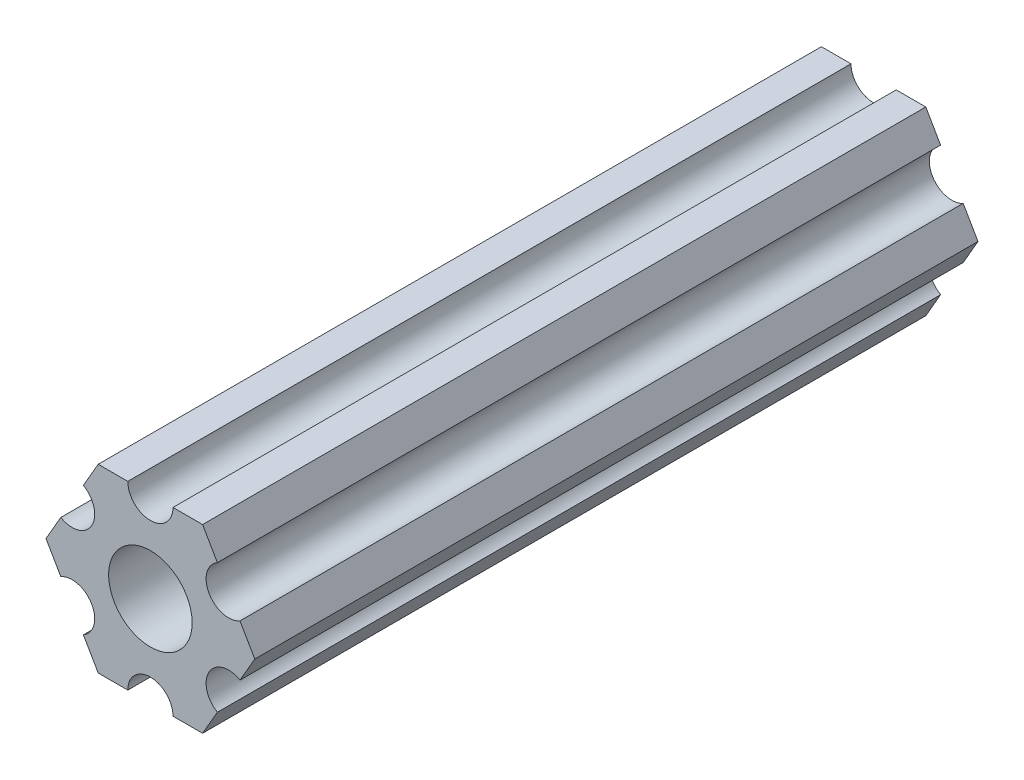
ISO-10303-21;
HEADER;
FILE_DESCRIPTION(('STEP AP214'),'2;1');
FILE_NAME('part.step','',(''),(''),'','','');
FILE_SCHEMA(('AUTOMOTIVE_DESIGN { 1 0 10303 214 1 1 1 1 }'));
ENDSEC;
DATA;
#1=APPLICATION_CONTEXT('core data for automotive mechanical design processes');
#2=APPLICATION_PROTOCOL_DEFINITION('international standard','automotive_design',2000,#1);
#3=PRODUCT_CONTEXT('',#1,'mechanical');
#4=PRODUCT('Part','Part','',(#3));
#5=PRODUCT_RELATED_PRODUCT_CATEGORY('part','',(#4));
#6=PRODUCT_DEFINITION_FORMATION('','',#4);
#7=PRODUCT_DEFINITION_CONTEXT('part definition',#1,'design');
#8=PRODUCT_DEFINITION('design','',#6,#7);
#9=PRODUCT_DEFINITION_SHAPE('','',#8);
#10=(LENGTH_UNIT() NAMED_UNIT(*) SI_UNIT(.MILLI.,.METRE.));
#11=(NAMED_UNIT(*) PLANE_ANGLE_UNIT() SI_UNIT($,.RADIAN.));
#12=(NAMED_UNIT(*) SI_UNIT($,.STERADIAN.) SOLID_ANGLE_UNIT());
#13=UNCERTAINTY_MEASURE_WITH_UNIT(LENGTH_MEASURE(1.E-05),#10,'distance_accuracy_value','');
#14=(GEOMETRIC_REPRESENTATION_CONTEXT(3) GLOBAL_UNCERTAINTY_ASSIGNED_CONTEXT((#13)) GLOBAL_UNIT_ASSIGNED_CONTEXT((#10,
#11,#12)) REPRESENTATION_CONTEXT('',''));
#15=CARTESIAN_POINT('',(0.,0.,0.));
#16=DIRECTION('',(0.,0.,1.));
#17=DIRECTION('',(1.,0.,0.));
#18=AXIS2_PLACEMENT_3D('',#15,#16,#17);
#19=CARTESIAN_POINT('',(5.49926150638083,-3.17499966684068,-50.8));
#20=DIRECTION('',(0.,0.,1.));
#21=DIRECTION('',(1.,0.,0.));
#22=AXIS2_PLACEMENT_3D('',#19,#20,#21);
#23=PLANE('',#22);
#24=CARTESIAN_POINT('',(5.49926150638083,-3.17499966684068,-50.8));
#25=DIRECTION('',(0.,0.,1.));
#26=DIRECTION('',(1.,0.,0.));
#27=AXIS2_PLACEMENT_3D('',#24,#25,#26);
#28=CIRCLE('',#27,1.58750000000001);
#29=CARTESIAN_POINT('',(6.29301142309098,-1.80018429024546,-50.8));
#30=VERTEX_POINT('',#29);
#31=CARTESIAN_POINT('',(4.70551158967068,-4.54981504343589,-50.8));
#32=VERTEX_POINT('',#31);
#33=EDGE_CURVE('E225',#30,#32,#28,.T.);
#34=ORIENTED_EDGE('',*,*,#33,.T.);
#35=DIRECTION('',(-0.499999947533953,-0.866025434075723,0.));
#36=VECTOR('',#35,1.);
#37=CARTESIAN_POINT('',(4.70551158967068,-4.54981504343589,-50.8));
#38=LINE('',#37,#36);
#39=CARTESIAN_POINT('',(3.66617452134693,-6.34999990382519,-50.8));
#40=VERTEX_POINT('',#39);
#41=EDGE_CURVE('E123',#32,#40,#38,.T.);
#42=ORIENTED_EDGE('',*,*,#41,.T.);
#43=DIRECTION('',(-1.,0.,0.));
#44=VECTOR('',#43,1.);
#45=CARTESIAN_POINT('',(3.66617452134693,-6.34999990382519,-50.8));
#46=LINE('',#45,#44);
#47=CARTESIAN_POINT('',(1.58750038469926,-6.34999990382518,-50.8));
#48=VERTEX_POINT('',#47);
#49=EDGE_CURVE('E270',#40,#48,#46,.T.);
#50=ORIENTED_EDGE('',*,*,#49,.T.);
#51=CARTESIAN_POINT('',(3.8469926204343E-07,-6.34999990382519,-50.8));
#52=DIRECTION('',(0.,0.,1.));
#53=DIRECTION('',(1.,0.,0.));
#54=AXIS2_PLACEMENT_3D('',#51,#52,#53);
#55=CIRCLE('',#54,1.5875);
#56=CARTESIAN_POINT('',(-1.58749961530074,-6.34999990382519,-50.8));
#57=VERTEX_POINT('',#56);
#58=EDGE_CURVE('E289',#48,#57,#55,.T.);
#59=ORIENTED_EDGE('',*,*,#58,.T.);
#60=DIRECTION('',(-1.,0.,0.));
#61=VECTOR('',#60,1.);
#62=CARTESIAN_POINT('',(-1.58749961530074,-6.34999990382519,-50.8));
#63=LINE('',#62,#61);
#64=CARTESIAN_POINT('',(-3.66617382465481,-6.34999990382519,-50.8));
#65=VERTEX_POINT('',#64);
#66=EDGE_CURVE('E286',#57,#65,#63,.T.);
#67=ORIENTED_EDGE('',*,*,#66,.T.);
#68=DIRECTION('',(-0.500000006198653,0.866025400205644,0.));
#69=VECTOR('',#68,1.);
#70=CARTESIAN_POINT('',(-3.66617382465481,-6.34999990382519,-50.8));
#71=LINE('',#70,#69);
#72=CARTESIAN_POINT('',(-4.70551094221689,-4.54981523977206,-50.8));
#73=VERTEX_POINT('',#72);
#74=EDGE_CURVE('E288',#65,#73,#71,.T.);
#75=ORIENTED_EDGE('',*,*,#74,.T.);
#76=CARTESIAN_POINT('',(-5.49926095205725,-3.1749999169456,-50.8));
#77=DIRECTION('',(0.,0.,1.));
#78=DIRECTION('',(1.,0.,0.));
#79=AXIS2_PLACEMENT_3D('',#76,#77,#78);
#80=CIRCLE('',#79,1.5875);
#81=CARTESIAN_POINT('',(-6.29301096189761,-1.80018459411914,-50.8));
#82=VERTEX_POINT('',#81);
#83=EDGE_CURVE('E291',#73,#82,#80,.T.);
#84=ORIENTED_EDGE('',*,*,#83,.T.);
#85=DIRECTION('',(-0.500000006198653,0.866025400205645,0.));
#86=VECTOR('',#85,1.);
#87=CARTESIAN_POINT('',(-6.29301096189761,-1.80018459411914,-50.8));
#88=LINE('',#87,#86);
#89=CARTESIAN_POINT('',(-7.33234807945963,6.99338729030344E-08,-50.8));
#90=VERTEX_POINT('',#89);
#91=EDGE_CURVE('E297',#82,#90,#88,.T.);
#92=ORIENTED_EDGE('',*,*,#91,.T.);
#93=DIRECTION('',(0.499999924400249,0.866025447431971,0.));
#94=VECTOR('',#93,1.);
#95=CARTESIAN_POINT('',(-7.33234807945963,6.99338729030344E-08,-50.8));
#96=LINE('',#95,#94);
#97=CARTESIAN_POINT('',(-6.29301121674195,1.80018468525613,-50.8));
#98=VERTEX_POINT('',#97);
#99=EDGE_CURVE('E299',#90,#98,#96,.T.);
#100=ORIENTED_EDGE('',*,*,#99,.T.);
#101=CARTESIAN_POINT('',(-5.49926133675655,3.17500008305439,-50.8));
#102=DIRECTION('',(0.,0.,1.));
#103=DIRECTION('',(1.,0.,0.));
#104=AXIS2_PLACEMENT_3D('',#101,#102,#103);
#105=CIRCLE('',#104,1.5875);
#106=CARTESIAN_POINT('',(-4.70551145677116,4.54981548085265,-50.8));
#107=VERTEX_POINT('',#106);
#108=EDGE_CURVE('E301',#98,#107,#105,.T.);
#109=ORIENTED_EDGE('',*,*,#108,.T.);
#110=DIRECTION('',(0.499999924400249,0.866025447431971,0.));
#111=VECTOR('',#110,1.);
#112=CARTESIAN_POINT('',(-4.70551145677116,4.54981548085265,-50.8));
#113=LINE('',#112,#111);
#114=CARTESIAN_POINT('',(-3.66617452134701,6.35000022210623,-50.8));
#115=VERTEX_POINT('',#114);
#116=EDGE_CURVE('E303',#107,#115,#113,.T.);
#117=ORIENTED_EDGE('',*,*,#116,.T.);
#118=DIRECTION('',(1.,0.,0.));
#119=VECTOR('',#118,1.);
#120=CARTESIAN_POINT('',(-3.66617452134701,6.35000022210623,-50.8));
#121=LINE('',#120,#119);
#122=CARTESIAN_POINT('',(-1.58750038469935,6.35000022210623,-50.8));
#123=VERTEX_POINT('',#122);
#124=EDGE_CURVE('E305',#115,#123,#121,.T.);
#125=ORIENTED_EDGE('',*,*,#124,.T.);
#126=CARTESIAN_POINT('',(-3.84699344941095E-07,6.35000022210623,-50.8));
#127=DIRECTION('',(0.,0.,1.));
#128=DIRECTION('',(1.,0.,0.));
#129=AXIS2_PLACEMENT_3D('',#126,#127,#128);
#130=CIRCLE('',#129,1.5875);
#131=CARTESIAN_POINT('',(1.58749961530066,6.35000022210623,-50.8));
#132=VERTEX_POINT('',#131);
#133=EDGE_CURVE('E307',#123,#132,#130,.T.);
#134=ORIENTED_EDGE('',*,*,#133,.T.);
#135=DIRECTION('',(1.,0.,0.));
#136=VECTOR('',#135,1.);
#137=CARTESIAN_POINT('',(1.58749961530066,6.35000022210623,-50.8));
#138=LINE('',#137,#136);
#139=CARTESIAN_POINT('',(3.66617382465472,6.35000022210622,-50.8));
#140=VERTEX_POINT('',#139);
#141=EDGE_CURVE('E309',#132,#140,#138,.T.);
#142=ORIENTED_EDGE('',*,*,#141,.T.);
#143=DIRECTION('',(0.500000052466056,-0.866025373493145,0.));
#144=VECTOR('',#143,1.);
#145=CARTESIAN_POINT('',(3.66617382465472,6.35000022210622,-50.8));
#146=LINE('',#145,#144);
#147=CARTESIAN_POINT('',(4.70551103839166,4.54981561357968,-50.8));
#148=VERTEX_POINT('',#147);
#149=EDGE_CURVE('E172',#140,#148,#146,.T.);
#150=ORIENTED_EDGE('',*,*,#149,.T.);
#151=CARTESIAN_POINT('',(5.49926112168152,3.17500033315931,-50.8));
#152=DIRECTION('',(0.,0.,1.));
#153=DIRECTION('',(1.,0.,0.));
#154=AXIS2_PLACEMENT_3D('',#151,#152,#153);
#155=CIRCLE('',#154,1.5875);
#156=CARTESIAN_POINT('',(6.29301120497139,1.80018505273895,-50.8));
#157=VERTEX_POINT('',#156);
#158=EDGE_CURVE('E166',#148,#157,#155,.T.);
#159=ORIENTED_EDGE('',*,*,#158,.T.);
#160=DIRECTION('',(0.500000052466056,-0.866025373493145,0.));
#161=VECTOR('',#160,1.);
#162=CARTESIAN_POINT('',(6.29301120497139,1.80018505273895,-50.8));
#163=LINE('',#162,#161);
#164=CARTESIAN_POINT('',(7.33234841870826,4.44212518856872E-07,-50.8));
#165=VERTEX_POINT('',#164);
#166=EDGE_CURVE('E170',#157,#165,#163,.T.);
#167=ORIENTED_EDGE('',*,*,#166,.T.);
#168=DIRECTION('',(-0.499999947533953,-0.866025434075723,0.));
#169=VECTOR('',#168,1.);
#170=CARTESIAN_POINT('',(7.33234841870826,4.44212518856872E-07,-50.8));
#171=LINE('',#170,#169);
#172=EDGE_CURVE('E50',#165,#30,#171,.T.);
#173=ORIENTED_EDGE('',*,*,#172,.T.);
#174=EDGE_LOOP('',(#34,#42,#50,#59,#67,#75,#84,#92,#100,#109,#117,#125,#134,#142,#150,#159,#167,#173));
#175=FACE_BOUND('',#174,.T.);
#176=CARTESIAN_POINT('',(0.,0.,-50.8));
#177=DIRECTION('',(0.,0.,-1.));
#178=DIRECTION('',(1.,0.,0.));
#179=AXIS2_PLACEMENT_3D('',#176,#177,#178);
#180=CIRCLE('',#179,2.9337);
#181=CARTESIAN_POINT('',(2.9337,0.,-50.8));
#182=VERTEX_POINT('',#181);
#183=EDGE_CURVE('E194',#182,#182,#180,.T.);
#184=ORIENTED_EDGE('',*,*,#183,.F.);
#185=EDGE_LOOP('',(#184));
#186=FACE_BOUND('',#185,.T.);
#187=ADVANCED_FACE('F33',(#175,#186),#23,.F.);
#188=CARTESIAN_POINT('',(5.49926150638083,-3.17499966684068,0.));
#189=DIRECTION('',(0.,0.,1.));
#190=DIRECTION('',(1.,0.,0.));
#191=AXIS2_PLACEMENT_3D('',#188,#189,#190);
#192=PLANE('',#191);
#193=CARTESIAN_POINT('',(5.49926150638083,-3.17499966684068,0.));
#194=DIRECTION('',(0.,0.,1.));
#195=DIRECTION('',(1.,0.,0.));
#196=AXIS2_PLACEMENT_3D('',#193,#194,#195);
#197=CIRCLE('',#196,1.58750000000001);
#198=CARTESIAN_POINT('',(6.29301142309098,-1.80018429024546,0.));
#199=VERTEX_POINT('',#198);
#200=CARTESIAN_POINT('',(4.70551158967068,-4.54981504343589,0.));
#201=VERTEX_POINT('',#200);
#202=EDGE_CURVE('E190',#199,#201,#197,.T.);
#203=ORIENTED_EDGE('',*,*,#202,.F.);
#204=DIRECTION('',(-0.499999947533953,-0.866025434075723,0.));
#205=VECTOR('',#204,1.);
#206=CARTESIAN_POINT('',(7.33234841870826,4.44212518856872E-07,0.));
#207=LINE('',#206,#205);
#208=CARTESIAN_POINT('',(7.33234841870826,4.44212518856872E-07,0.));
#209=VERTEX_POINT('',#208);
#210=EDGE_CURVE('E115',#209,#199,#207,.T.);
#211=ORIENTED_EDGE('',*,*,#210,.F.);
#212=DIRECTION('',(0.500000052466056,-0.866025373493145,0.));
#213=VECTOR('',#212,1.);
#214=CARTESIAN_POINT('',(6.29301120497139,1.80018505273895,0.));
#215=LINE('',#214,#213);
#216=CARTESIAN_POINT('',(6.29301120497139,1.80018505273895,0.));
#217=VERTEX_POINT('',#216);
#218=EDGE_CURVE('E109',#217,#209,#215,.T.);
#219=ORIENTED_EDGE('',*,*,#218,.F.);
#220=CARTESIAN_POINT('',(5.49926112168152,3.17500033315931,0.));
#221=DIRECTION('',(0.,0.,1.));
#222=DIRECTION('',(1.,0.,0.));
#223=AXIS2_PLACEMENT_3D('',#220,#221,#222);
#224=CIRCLE('',#223,1.5875);
#225=CARTESIAN_POINT('',(4.70551103839166,4.54981561357968,0.));
#226=VERTEX_POINT('',#225);
#227=EDGE_CURVE('E180',#226,#217,#224,.T.);
#228=ORIENTED_EDGE('',*,*,#227,.F.);
#229=DIRECTION('',(0.500000052466056,-0.866025373493145,0.));
#230=VECTOR('',#229,1.);
#231=CARTESIAN_POINT('',(3.66617382465472,6.35000022210622,0.));
#232=LINE('',#231,#230);
#233=CARTESIAN_POINT('',(3.66617382465472,6.35000022210622,0.));
#234=VERTEX_POINT('',#233);
#235=EDGE_CURVE('E220',#234,#226,#232,.T.);
#236=ORIENTED_EDGE('',*,*,#235,.F.);
#237=DIRECTION('',(1.,0.,0.));
#238=VECTOR('',#237,1.);
#239=CARTESIAN_POINT('',(1.58749961530066,6.35000022210623,0.));
#240=LINE('',#239,#238);
#241=CARTESIAN_POINT('',(1.58749961530066,6.35000022210623,0.));
#242=VERTEX_POINT('',#241);
#243=EDGE_CURVE('E218',#242,#234,#240,.T.);
#244=ORIENTED_EDGE('',*,*,#243,.F.);
#245=CARTESIAN_POINT('',(-3.84699344941095E-07,6.35000022210623,0.));
#246=DIRECTION('',(0.,0.,1.));
#247=DIRECTION('',(1.,0.,0.));
#248=AXIS2_PLACEMENT_3D('',#245,#246,#247);
#249=CIRCLE('',#248,1.5875);
#250=CARTESIAN_POINT('',(-1.58750038469935,6.35000022210623,0.));
#251=VERTEX_POINT('',#250);
#252=EDGE_CURVE('E216',#251,#242,#249,.T.);
#253=ORIENTED_EDGE('',*,*,#252,.F.);
#254=DIRECTION('',(1.,0.,0.));
#255=VECTOR('',#254,1.);
#256=CARTESIAN_POINT('',(-3.66617452134701,6.35000022210623,0.));
#257=LINE('',#256,#255);
#258=CARTESIAN_POINT('',(-3.66617452134701,6.35000022210623,0.));
#259=VERTEX_POINT('',#258);
#260=EDGE_CURVE('E214',#259,#251,#257,.T.);
#261=ORIENTED_EDGE('',*,*,#260,.F.);
#262=DIRECTION('',(0.499999924400249,0.866025447431971,0.));
#263=VECTOR('',#262,1.);
#264=CARTESIAN_POINT('',(-4.70551145677116,4.54981548085265,0.));
#265=LINE('',#264,#263);
#266=CARTESIAN_POINT('',(-4.70551145677116,4.54981548085265,0.));
#267=VERTEX_POINT('',#266);
#268=EDGE_CURVE('E212',#267,#259,#265,.T.);
#269=ORIENTED_EDGE('',*,*,#268,.F.);
#270=CARTESIAN_POINT('',(-5.49926133675655,3.17500008305439,0.));
#271=DIRECTION('',(0.,0.,1.));
#272=DIRECTION('',(1.,0.,0.));
#273=AXIS2_PLACEMENT_3D('',#270,#271,#272);
#274=CIRCLE('',#273,1.5875);
#275=CARTESIAN_POINT('',(-6.29301121674195,1.80018468525613,0.));
#276=VERTEX_POINT('',#275);
#277=EDGE_CURVE('E210',#276,#267,#274,.T.);
#278=ORIENTED_EDGE('',*,*,#277,.F.);
#279=DIRECTION('',(0.499999924400249,0.866025447431971,0.));
#280=VECTOR('',#279,1.);
#281=CARTESIAN_POINT('',(-7.33234807945963,6.99338729030344E-08,0.));
#282=LINE('',#281,#280);
#283=CARTESIAN_POINT('',(-7.33234807945963,6.99338729030344E-08,0.));
#284=VERTEX_POINT('',#283);
#285=EDGE_CURVE('E208',#284,#276,#282,.T.);
#286=ORIENTED_EDGE('',*,*,#285,.F.);
#287=DIRECTION('',(-0.500000006198653,0.866025400205645,0.));
#288=VECTOR('',#287,1.);
#289=CARTESIAN_POINT('',(-6.29301096189761,-1.80018459411914,0.));
#290=LINE('',#289,#288);
#291=CARTESIAN_POINT('',(-6.29301096189761,-1.80018459411914,0.));
#292=VERTEX_POINT('',#291);
#293=EDGE_CURVE('E206',#292,#284,#290,.T.);
#294=ORIENTED_EDGE('',*,*,#293,.F.);
#295=CARTESIAN_POINT('',(-5.49926095205725,-3.1749999169456,0.));
#296=DIRECTION('',(0.,0.,1.));
#297=DIRECTION('',(1.,0.,0.));
#298=AXIS2_PLACEMENT_3D('',#295,#296,#297);
#299=CIRCLE('',#298,1.5875);
#300=CARTESIAN_POINT('',(-4.70551094221689,-4.54981523977206,0.));
#301=VERTEX_POINT('',#300);
#302=EDGE_CURVE('E204',#301,#292,#299,.T.);
#303=ORIENTED_EDGE('',*,*,#302,.F.);
#304=DIRECTION('',(-0.500000006198653,0.866025400205644,0.));
#305=VECTOR('',#304,1.);
#306=CARTESIAN_POINT('',(-3.66617382465481,-6.34999990382519,0.));
#307=LINE('',#306,#305);
#308=CARTESIAN_POINT('',(-3.66617382465481,-6.34999990382519,0.));
#309=VERTEX_POINT('',#308);
#310=EDGE_CURVE('E202',#309,#301,#307,.T.);
#311=ORIENTED_EDGE('',*,*,#310,.F.);
#312=DIRECTION('',(-1.,0.,0.));
#313=VECTOR('',#312,1.);
#314=CARTESIAN_POINT('',(-1.58749961530074,-6.34999990382519,0.));
#315=LINE('',#314,#313);
#316=CARTESIAN_POINT('',(-1.58749961530074,-6.34999990382519,0.));
#317=VERTEX_POINT('',#316);
#318=EDGE_CURVE('E200',#317,#309,#315,.T.);
#319=ORIENTED_EDGE('',*,*,#318,.F.);
#320=CARTESIAN_POINT('',(3.8469926204343E-07,-6.34999990382519,0.));
#321=DIRECTION('',(0.,0.,1.));
#322=DIRECTION('',(1.,0.,0.));
#323=AXIS2_PLACEMENT_3D('',#320,#321,#322);
#324=CIRCLE('',#323,1.5875);
#325=CARTESIAN_POINT('',(1.58750038469926,-6.34999990382518,0.));
#326=VERTEX_POINT('',#325);
#327=EDGE_CURVE('E198',#326,#317,#324,.T.);
#328=ORIENTED_EDGE('',*,*,#327,.F.);
#329=DIRECTION('',(-1.,0.,0.));
#330=VECTOR('',#329,1.);
#331=CARTESIAN_POINT('',(3.66617452134693,-6.34999990382519,0.));
#332=LINE('',#331,#330);
#333=CARTESIAN_POINT('',(3.66617452134693,-6.34999990382519,0.));
#334=VERTEX_POINT('',#333);
#335=EDGE_CURVE('E196',#334,#326,#332,.T.);
#336=ORIENTED_EDGE('',*,*,#335,.F.);
#337=DIRECTION('',(-0.499999947533953,-0.866025434075723,0.));
#338=VECTOR('',#337,1.);
#339=CARTESIAN_POINT('',(4.70551158967068,-4.54981504343589,0.));
#340=LINE('',#339,#338);
#341=EDGE_CURVE('E193',#201,#334,#340,.T.);
#342=ORIENTED_EDGE('',*,*,#341,.F.);
#343=EDGE_LOOP('',(#203,#211,#219,#228,#236,#244,#253,#261,#269,#278,#286,#294,#303,#311,#319,
#328,#336,#342));
#344=FACE_BOUND('',#343,.T.);
#345=CARTESIAN_POINT('',(0.,0.,0.));
#346=DIRECTION('',(0.,0.,-1.));
#347=DIRECTION('',(1.,0.,0.));
#348=AXIS2_PLACEMENT_3D('',#345,#346,#347);
#349=CIRCLE('',#348,2.9337);
#350=CARTESIAN_POINT('',(2.9337,0.,0.));
#351=VERTEX_POINT('',#350);
#352=EDGE_CURVE('E534',#351,#351,#349,.T.);
#353=ORIENTED_EDGE('',*,*,#352,.T.);
#354=EDGE_LOOP('',(#353));
#355=FACE_BOUND('',#354,.T.);
#356=ADVANCED_FACE('F274',(#344,#355),#192,.T.);
#357=CARTESIAN_POINT('',(5.49926150638083,-3.17499966684068,-50.8));
#358=DIRECTION('',(0.,0.,1.));
#359=DIRECTION('',(1.,0.,0.));
#360=AXIS2_PLACEMENT_3D('',#357,#358,#359);
#361=CYLINDRICAL_SURFACE('',#360,1.58750000000001);
#362=ORIENTED_EDGE('',*,*,#202,.T.);
#363=DIRECTION('',(0.,0.,1.));
#364=VECTOR('',#363,1.);
#365=CARTESIAN_POINT('',(4.70551158967068,-4.54981504343589,-50.8));
#366=LINE('',#365,#364);
#367=EDGE_CURVE('E11',#32,#201,#366,.T.);
#368=ORIENTED_EDGE('',*,*,#367,.F.);
#369=ORIENTED_EDGE('',*,*,#33,.F.);
#370=DIRECTION('',(0.,0.,1.));
#371=VECTOR('',#370,1.);
#372=CARTESIAN_POINT('',(6.29301142309098,-1.80018429024546,-50.8));
#373=LINE('',#372,#371);
#374=EDGE_CURVE('E186',#30,#199,#373,.T.);
#375=ORIENTED_EDGE('',*,*,#374,.T.);
#376=EDGE_LOOP('',(#362,#368,#369,#375));
#377=FACE_BOUND('',#376,.T.);
#378=ADVANCED_FACE('F35',(#377),#361,.F.);
#379=CARTESIAN_POINT('',(4.70551158967068,-4.54981504343589,-50.8));
#380=DIRECTION('',(-0.866025434075723,0.499999947533953,0.));
#381=DIRECTION('',(-0.499999947533953,-0.866025434075723,0.));
#382=AXIS2_PLACEMENT_3D('',#379,#380,#381);
#383=PLANE('',#382);
#384=ORIENTED_EDGE('',*,*,#341,.T.);
#385=DIRECTION('',(0.,0.,1.));
#386=VECTOR('',#385,1.);
#387=CARTESIAN_POINT('',(3.66617452134693,-6.34999990382519,-50.8));
#388=LINE('',#387,#386);
#389=EDGE_CURVE('E42',#40,#334,#388,.T.);
#390=ORIENTED_EDGE('',*,*,#389,.F.);
#391=ORIENTED_EDGE('',*,*,#41,.F.);
#392=ORIENTED_EDGE('',*,*,#367,.T.);
#393=EDGE_LOOP('',(#384,#390,#391,#392));
#394=FACE_BOUND('',#393,.T.);
#395=ADVANCED_FACE('F343',(#394),#383,.F.);
#396=CARTESIAN_POINT('',(3.66617452134693,-6.34999990382519,-50.8));
#397=DIRECTION('',(0.,1.,0.));
#398=DIRECTION('',(-1.,0.,0.));
#399=AXIS2_PLACEMENT_3D('',#396,#397,#398);
#400=PLANE('',#399);
#401=ORIENTED_EDGE('',*,*,#335,.T.);
#402=DIRECTION('',(0.,0.,1.));
#403=VECTOR('',#402,1.);
#404=CARTESIAN_POINT('',(1.58750038469926,-6.34999990382518,-50.8));
#405=LINE('',#404,#403);
#406=EDGE_CURVE('E262',#48,#326,#405,.T.);
#407=ORIENTED_EDGE('',*,*,#406,.F.);
#408=ORIENTED_EDGE('',*,*,#49,.F.);
#409=ORIENTED_EDGE('',*,*,#389,.T.);
#410=EDGE_LOOP('',(#401,#407,#408,#409));
#411=FACE_BOUND('',#410,.T.);
#412=ADVANCED_FACE('F268',(#411),#400,.F.);
#413=CARTESIAN_POINT('',(3.8469926204343E-07,-6.34999990382519,-50.8));
#414=DIRECTION('',(0.,0.,1.));
#415=DIRECTION('',(1.,0.,0.));
#416=AXIS2_PLACEMENT_3D('',#413,#414,#415);
#417=CYLINDRICAL_SURFACE('',#416,1.5875);
#418=ORIENTED_EDGE('',*,*,#327,.T.);
#419=DIRECTION('',(0.,0.,1.));
#420=VECTOR('',#419,1.);
#421=CARTESIAN_POINT('',(-1.58749961530074,-6.34999990382519,-50.8));
#422=LINE('',#421,#420);
#423=EDGE_CURVE('E259',#57,#317,#422,.T.);
#424=ORIENTED_EDGE('',*,*,#423,.F.);
#425=ORIENTED_EDGE('',*,*,#58,.F.);
#426=ORIENTED_EDGE('',*,*,#406,.T.);
#427=EDGE_LOOP('',(#418,#424,#425,#426));
#428=FACE_BOUND('',#427,.T.);
#429=ADVANCED_FACE('F280',(#428),#417,.F.);
#430=CARTESIAN_POINT('',(-1.58749961530074,-6.34999990382519,-50.8));
#431=DIRECTION('',(0.,1.,0.));
#432=DIRECTION('',(-1.,0.,0.));
#433=AXIS2_PLACEMENT_3D('',#430,#431,#432);
#434=PLANE('',#433);
#435=ORIENTED_EDGE('',*,*,#318,.T.);
#436=DIRECTION('',(0.,0.,1.));
#437=VECTOR('',#436,1.);
#438=CARTESIAN_POINT('',(-3.66617382465481,-6.34999990382519,-50.8));
#439=LINE('',#438,#437);
#440=EDGE_CURVE('E256',#65,#309,#439,.T.);
#441=ORIENTED_EDGE('',*,*,#440,.F.);
#442=ORIENTED_EDGE('',*,*,#66,.F.);
#443=ORIENTED_EDGE('',*,*,#423,.T.);
#444=EDGE_LOOP('',(#435,#441,#442,#443));
#445=FACE_BOUND('',#444,.T.);
#446=ADVANCED_FACE('F284',(#445),#434,.F.);
#447=CARTESIAN_POINT('',(-3.66617382465481,-6.34999990382519,-50.8));
#448=DIRECTION('',(0.866025400205644,0.500000006198653,0.));
#449=DIRECTION('',(-0.500000006198653,0.866025400205645,0.));
#450=AXIS2_PLACEMENT_3D('',#447,#448,#449);
#451=PLANE('',#450);
#452=ORIENTED_EDGE('',*,*,#310,.T.);
#453=DIRECTION('',(0.,0.,1.));
#454=VECTOR('',#453,1.);
#455=CARTESIAN_POINT('',(-4.70551094221689,-4.54981523977206,-50.8));
#456=LINE('',#455,#454);
#457=EDGE_CURVE('E253',#73,#301,#456,.T.);
#458=ORIENTED_EDGE('',*,*,#457,.F.);
#459=ORIENTED_EDGE('',*,*,#74,.F.);
#460=ORIENTED_EDGE('',*,*,#440,.T.);
#461=EDGE_LOOP('',(#452,#458,#459,#460));
#462=FACE_BOUND('',#461,.T.);
#463=ADVANCED_FACE('F356',(#462),#451,.F.);
#464=CARTESIAN_POINT('',(-5.49926095205725,-3.1749999169456,-50.8));
#465=DIRECTION('',(0.,0.,1.));
#466=DIRECTION('',(1.,0.,0.));
#467=AXIS2_PLACEMENT_3D('',#464,#465,#466);
#468=CYLINDRICAL_SURFACE('',#467,1.5875);
#469=ORIENTED_EDGE('',*,*,#302,.T.);
#470=DIRECTION('',(0.,0.,1.));
#471=VECTOR('',#470,1.);
#472=CARTESIAN_POINT('',(-6.29301096189761,-1.80018459411914,-50.8));
#473=LINE('',#472,#471);
#474=EDGE_CURVE('E250',#82,#292,#473,.T.);
#475=ORIENTED_EDGE('',*,*,#474,.F.);
#476=ORIENTED_EDGE('',*,*,#83,.F.);
#477=ORIENTED_EDGE('',*,*,#457,.T.);
#478=EDGE_LOOP('',(#469,#475,#476,#477));
#479=FACE_BOUND('',#478,.T.);
#480=ADVANCED_FACE('F359',(#479),#468,.F.);
#481=CARTESIAN_POINT('',(-6.29301096189761,-1.80018459411914,-50.8));
#482=DIRECTION('',(0.866025400205645,0.500000006198653,0.));
#483=DIRECTION('',(-0.500000006198653,0.866025400205645,0.));
#484=AXIS2_PLACEMENT_3D('',#481,#482,#483);
#485=PLANE('',#484);
#486=ORIENTED_EDGE('',*,*,#293,.T.);
#487=DIRECTION('',(0.,0.,1.));
#488=VECTOR('',#487,1.);
#489=CARTESIAN_POINT('',(-7.33234807945963,6.99338729030344E-08,-50.8));
#490=LINE('',#489,#488);
#491=EDGE_CURVE('E247',#90,#284,#490,.T.);
#492=ORIENTED_EDGE('',*,*,#491,.F.);
#493=ORIENTED_EDGE('',*,*,#91,.F.);
#494=ORIENTED_EDGE('',*,*,#474,.T.);
#495=EDGE_LOOP('',(#486,#492,#493,#494));
#496=FACE_BOUND('',#495,.T.);
#497=ADVANCED_FACE('F363',(#496),#485,.F.);
#498=CARTESIAN_POINT('',(-7.33234807945963,6.99338729030344E-08,-50.8));
#499=DIRECTION('',(0.866025447431971,-0.499999924400249,0.));
#500=DIRECTION('',(0.499999924400249,0.866025447431971,0.));
#501=AXIS2_PLACEMENT_3D('',#498,#499,#500);
#502=PLANE('',#501);
#503=ORIENTED_EDGE('',*,*,#285,.T.);
#504=DIRECTION('',(0.,0.,1.));
#505=VECTOR('',#504,1.);
#506=CARTESIAN_POINT('',(-6.29301121674195,1.80018468525613,-50.8));
#507=LINE('',#506,#505);
#508=EDGE_CURVE('E244',#98,#276,#507,.T.);
#509=ORIENTED_EDGE('',*,*,#508,.F.);
#510=ORIENTED_EDGE('',*,*,#99,.F.);
#511=ORIENTED_EDGE('',*,*,#491,.T.);
#512=EDGE_LOOP('',(#503,#509,#510,#511));
#513=FACE_BOUND('',#512,.T.);
#514=ADVANCED_FACE('F367',(#513),#502,.F.);
#515=CARTESIAN_POINT('',(-5.49926133675655,3.17500008305439,-50.8));
#516=DIRECTION('',(0.,0.,1.));
#517=DIRECTION('',(1.,0.,0.));
#518=AXIS2_PLACEMENT_3D('',#515,#516,#517);
#519=CYLINDRICAL_SURFACE('',#518,1.5875);
#520=ORIENTED_EDGE('',*,*,#277,.T.);
#521=DIRECTION('',(0.,0.,1.));
#522=VECTOR('',#521,1.);
#523=CARTESIAN_POINT('',(-4.70551145677116,4.54981548085265,-50.8));
#524=LINE('',#523,#522);
#525=EDGE_CURVE('E241',#107,#267,#524,.T.);
#526=ORIENTED_EDGE('',*,*,#525,.F.);
#527=ORIENTED_EDGE('',*,*,#108,.F.);
#528=ORIENTED_EDGE('',*,*,#508,.T.);
#529=EDGE_LOOP('',(#520,#526,#527,#528));
#530=FACE_BOUND('',#529,.T.);
#531=ADVANCED_FACE('F371',(#530),#519,.F.);
#532=CARTESIAN_POINT('',(-4.70551145677116,4.54981548085265,-50.8));
#533=DIRECTION('',(0.866025447431971,-0.499999924400249,0.));
#534=DIRECTION('',(0.499999924400249,0.866025447431971,0.));
#535=AXIS2_PLACEMENT_3D('',#532,#533,#534);
#536=PLANE('',#535);
#537=ORIENTED_EDGE('',*,*,#268,.T.);
#538=DIRECTION('',(0.,0.,1.));
#539=VECTOR('',#538,1.);
#540=CARTESIAN_POINT('',(-3.66617452134701,6.35000022210623,-50.8));
#541=LINE('',#540,#539);
#542=EDGE_CURVE('E238',#115,#259,#541,.T.);
#543=ORIENTED_EDGE('',*,*,#542,.F.);
#544=ORIENTED_EDGE('',*,*,#116,.F.);
#545=ORIENTED_EDGE('',*,*,#525,.T.);
#546=EDGE_LOOP('',(#537,#543,#544,#545));
#547=FACE_BOUND('',#546,.T.);
#548=ADVANCED_FACE('F375',(#547),#536,.F.);
#549=CARTESIAN_POINT('',(-3.66617452134701,6.35000022210623,-50.8));
#550=DIRECTION('',(0.,-1.,0.));
#551=DIRECTION('',(0.,0.,-1.));
#552=AXIS2_PLACEMENT_3D('',#549,#550,#551);
#553=PLANE('',#552);
#554=ORIENTED_EDGE('',*,*,#260,.T.);
#555=DIRECTION('',(0.,0.,1.));
#556=VECTOR('',#555,1.);
#557=CARTESIAN_POINT('',(-1.58750038469935,6.35000022210623,-50.8));
#558=LINE('',#557,#556);
#559=EDGE_CURVE('E235',#123,#251,#558,.T.);
#560=ORIENTED_EDGE('',*,*,#559,.F.);
#561=ORIENTED_EDGE('',*,*,#124,.F.);
#562=ORIENTED_EDGE('',*,*,#542,.T.);
#563=EDGE_LOOP('',(#554,#560,#561,#562));
#564=FACE_BOUND('',#563,.T.);
#565=ADVANCED_FACE('F379',(#564),#553,.F.);
#566=CARTESIAN_POINT('',(-3.84699344941095E-07,6.35000022210623,-50.8));
#567=DIRECTION('',(0.,0.,1.));
#568=DIRECTION('',(1.,0.,0.));
#569=AXIS2_PLACEMENT_3D('',#566,#567,#568);
#570=CYLINDRICAL_SURFACE('',#569,1.5875);
#571=ORIENTED_EDGE('',*,*,#252,.T.);
#572=DIRECTION('',(0.,0.,1.));
#573=VECTOR('',#572,1.);
#574=CARTESIAN_POINT('',(1.58749961530066,6.35000022210623,-50.8));
#575=LINE('',#574,#573);
#576=EDGE_CURVE('E232',#132,#242,#575,.T.);
#577=ORIENTED_EDGE('',*,*,#576,.F.);
#578=ORIENTED_EDGE('',*,*,#133,.F.);
#579=ORIENTED_EDGE('',*,*,#559,.T.);
#580=EDGE_LOOP('',(#571,#577,#578,#579));
#581=FACE_BOUND('',#580,.T.);
#582=ADVANCED_FACE('F383',(#581),#570,.F.);
#583=CARTESIAN_POINT('',(1.58749961530066,6.35000022210623,-50.8));
#584=DIRECTION('',(0.,-1.,0.));
#585=DIRECTION('',(1.,0.,0.));
#586=AXIS2_PLACEMENT_3D('',#583,#584,#585);
#587=PLANE('',#586);
#588=ORIENTED_EDGE('',*,*,#243,.T.);
#589=DIRECTION('',(0.,0.,1.));
#590=VECTOR('',#589,1.);
#591=CARTESIAN_POINT('',(3.66617382465472,6.35000022210622,-50.8));
#592=LINE('',#591,#590);
#593=EDGE_CURVE('E229',#140,#234,#592,.T.);
#594=ORIENTED_EDGE('',*,*,#593,.F.);
#595=ORIENTED_EDGE('',*,*,#141,.F.);
#596=ORIENTED_EDGE('',*,*,#576,.T.);
#597=EDGE_LOOP('',(#588,#594,#595,#596));
#598=FACE_BOUND('',#597,.T.);
#599=ADVANCED_FACE('F315',(#598),#587,.F.);
#600=CARTESIAN_POINT('',(3.66617382465472,6.35000022210622,-50.8));
#601=DIRECTION('',(-0.866025373493145,-0.500000052466056,0.));
#602=DIRECTION('',(0.500000052466056,-0.866025373493145,0.));
#603=AXIS2_PLACEMENT_3D('',#600,#601,#602);
#604=PLANE('',#603);
#605=ORIENTED_EDGE('',*,*,#235,.T.);
#606=DIRECTION('',(0.,0.,1.));
#607=VECTOR('',#606,1.);
#608=CARTESIAN_POINT('',(4.70551103839166,4.54981561357968,-50.8));
#609=LINE('',#608,#607);
#610=EDGE_CURVE('E181',#148,#226,#609,.T.);
#611=ORIENTED_EDGE('',*,*,#610,.F.);
#612=ORIENTED_EDGE('',*,*,#149,.F.);
#613=ORIENTED_EDGE('',*,*,#593,.T.);
#614=EDGE_LOOP('',(#605,#611,#612,#613));
#615=FACE_BOUND('',#614,.T.);
#616=ADVANCED_FACE('F319',(#615),#604,.F.);
#617=CARTESIAN_POINT('',(5.49926112168152,3.17500033315931,-50.8));
#618=DIRECTION('',(0.,0.,1.));
#619=DIRECTION('',(1.,0.,0.));
#620=AXIS2_PLACEMENT_3D('',#617,#618,#619);
#621=CYLINDRICAL_SURFACE('',#620,1.5875);
#622=ORIENTED_EDGE('',*,*,#227,.T.);
#623=DIRECTION('',(0.,0.,1.));
#624=VECTOR('',#623,1.);
#625=CARTESIAN_POINT('',(6.29301120497139,1.80018505273895,-50.8));
#626=LINE('',#625,#624);
#627=EDGE_CURVE('E177',#157,#217,#626,.T.);
#628=ORIENTED_EDGE('',*,*,#627,.F.);
#629=ORIENTED_EDGE('',*,*,#158,.F.);
#630=ORIENTED_EDGE('',*,*,#610,.T.);
#631=EDGE_LOOP('',(#622,#628,#629,#630));
#632=FACE_BOUND('',#631,.T.);
#633=ADVANCED_FACE('F178',(#632),#621,.F.);
#634=CARTESIAN_POINT('',(6.29301120497139,1.80018505273895,-50.8));
#635=DIRECTION('',(-0.866025373493145,-0.500000052466056,0.));
#636=DIRECTION('',(0.500000052466056,-0.866025373493145,0.));
#637=AXIS2_PLACEMENT_3D('',#634,#635,#636);
#638=PLANE('',#637);
#639=ORIENTED_EDGE('',*,*,#218,.T.);
#640=DIRECTION('',(0.,0.,1.));
#641=VECTOR('',#640,1.);
#642=CARTESIAN_POINT('',(7.33234841870826,4.44212518856872E-07,-50.8));
#643=LINE('',#642,#641);
#644=EDGE_CURVE('E182',#165,#209,#643,.T.);
#645=ORIENTED_EDGE('',*,*,#644,.F.);
#646=ORIENTED_EDGE('',*,*,#166,.F.);
#647=ORIENTED_EDGE('',*,*,#627,.T.);
#648=EDGE_LOOP('',(#639,#645,#646,#647));
#649=FACE_BOUND('',#648,.T.);
#650=ADVANCED_FACE('F184',(#649),#638,.F.);
#651=CARTESIAN_POINT('',(7.33234841870826,4.44212518856872E-07,-50.8));
#652=DIRECTION('',(-0.866025434075723,0.499999947533953,0.));
#653=DIRECTION('',(-0.499999947533953,-0.866025434075723,0.));
#654=AXIS2_PLACEMENT_3D('',#651,#652,#653);
#655=PLANE('',#654);
#656=ORIENTED_EDGE('',*,*,#210,.T.);
#657=ORIENTED_EDGE('',*,*,#374,.F.);
#658=ORIENTED_EDGE('',*,*,#172,.F.);
#659=ORIENTED_EDGE('',*,*,#644,.T.);
#660=EDGE_LOOP('',(#656,#657,#658,#659));
#661=FACE_BOUND('',#660,.T.);
#662=ADVANCED_FACE('F323',(#661),#655,.F.);
#663=CARTESIAN_POINT('',(0.,0.,-50.8));
#664=DIRECTION('',(0.,0.,1.));
#665=DIRECTION('',(1.,0.,0.));
#666=AXIS2_PLACEMENT_3D('',#663,#664,#665);
#667=CYLINDRICAL_SURFACE('',#666,2.9337);
#668=ORIENTED_EDGE('',*,*,#183,.T.);
#669=EDGE_LOOP('',(#668));
#670=FACE_BOUND('',#669,.T.);
#671=ORIENTED_EDGE('',*,*,#352,.F.);
#672=EDGE_LOOP('',(#671));
#673=FACE_BOUND('',#672,.T.);
#674=ADVANCED_FACE('F325',(#670,#673),#667,.F.);
#675=CLOSED_SHELL('',(#187,#356,#378,#395,#412,#429,#446,#463,#480,#497,#514,#531,#548,#565,
#582,#599,#616,#633,#650,#662,#674));
#676=MANIFOLD_SOLID_BREP('B2',#675);
#677=ADVANCED_BREP_SHAPE_REPRESENTATION('',(#18,#676),#14);
#678=SHAPE_DEFINITION_REPRESENTATION(#9,#677);
ENDSEC;
END-ISO-10303-21;
